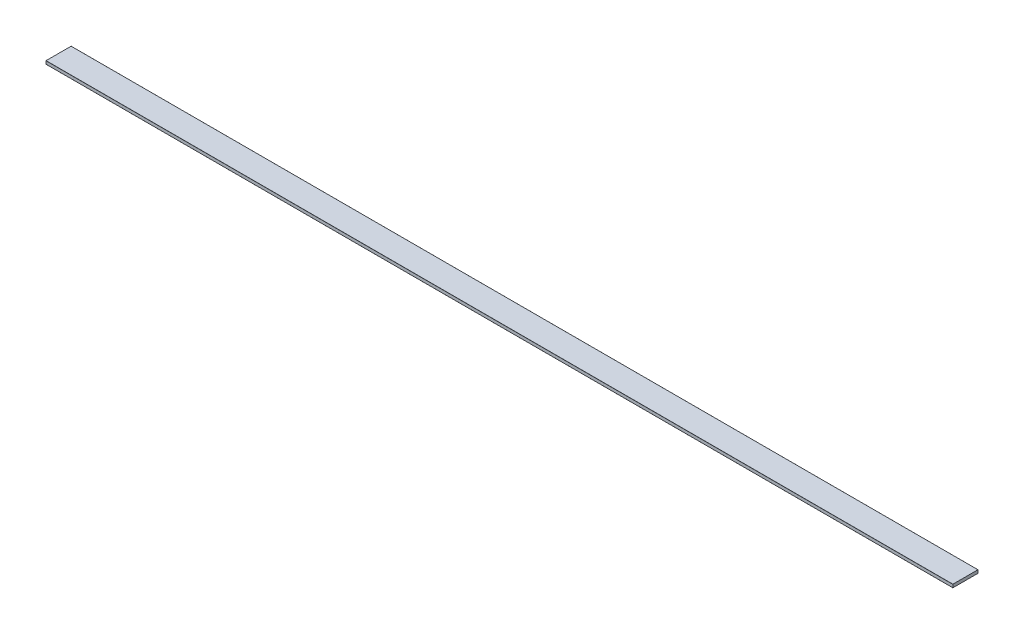
ISO-10303-21;
HEADER;
FILE_DESCRIPTION(('STEP AP214'),'2;1');
FILE_NAME('part.step','',(''),(''),'','','');
FILE_SCHEMA(('AUTOMOTIVE_DESIGN { 1 0 10303 214 1 1 1 1 }'));
ENDSEC;
DATA;
#1=APPLICATION_CONTEXT('core data for automotive mechanical design processes');
#2=APPLICATION_PROTOCOL_DEFINITION('international standard','automotive_design',2000,#1);
#3=PRODUCT_CONTEXT('',#1,'mechanical');
#4=PRODUCT('Part','Part','',(#3));
#5=PRODUCT_RELATED_PRODUCT_CATEGORY('part','',(#4));
#6=PRODUCT_DEFINITION_FORMATION('','',#4);
#7=PRODUCT_DEFINITION_CONTEXT('part definition',#1,'design');
#8=PRODUCT_DEFINITION('design','',#6,#7);
#9=PRODUCT_DEFINITION_SHAPE('','',#8);
#10=(LENGTH_UNIT() NAMED_UNIT(*) SI_UNIT(.MILLI.,.METRE.));
#11=(NAMED_UNIT(*) PLANE_ANGLE_UNIT() SI_UNIT($,.RADIAN.));
#12=(NAMED_UNIT(*) SI_UNIT($,.STERADIAN.) SOLID_ANGLE_UNIT());
#13=UNCERTAINTY_MEASURE_WITH_UNIT(LENGTH_MEASURE(1.E-05),#10,'distance_accuracy_value','');
#14=(GEOMETRIC_REPRESENTATION_CONTEXT(3) GLOBAL_UNCERTAINTY_ASSIGNED_CONTEXT((#13)) GLOBAL_UNIT_ASSIGNED_CONTEXT((#10,
#11,#12)) REPRESENTATION_CONTEXT('',''));
#15=CARTESIAN_POINT('',(0.,0.,0.));
#16=DIRECTION('',(0.,0.,1.));
#17=DIRECTION('',(1.,0.,0.));
#18=AXIS2_PLACEMENT_3D('',#15,#16,#17);
#19=CARTESIAN_POINT('',(-457.2,-1.58750000000001,-12.6999999999999));
#20=DIRECTION('',(-1.,0.,0.));
#21=DIRECTION('',(0.,0.,1.));
#22=AXIS2_PLACEMENT_3D('',#19,#20,#21);
#23=PLANE('',#22);
#24=DIRECTION('',(0.,0.,1.));
#25=VECTOR('',#24,1.);
#26=CARTESIAN_POINT('',(-457.2,-1.58750000000001,-12.6999999999999));
#27=LINE('',#26,#25);
#28=CARTESIAN_POINT('',(-457.2,-1.58750000000001,-12.5952249999999));
#29=VERTEX_POINT('',#28);
#30=CARTESIAN_POINT('',(-457.2,-1.58750000000001,12.5952249999999));
#31=VERTEX_POINT('',#30);
#32=EDGE_CURVE('E162',#29,#31,#27,.T.);
#33=ORIENTED_EDGE('',*,*,#32,.T.);
#34=CARTESIAN_POINT('',(-457.2,-1.48272500000001,12.5952249999999));
#35=DIRECTION('',(-1.,0.,0.));
#36=DIRECTION('',(0.,0.,1.));
#37=AXIS2_PLACEMENT_3D('',#34,#35,#36);
#38=CIRCLE('',#37,0.104775);
#39=CARTESIAN_POINT('',(-457.2,-1.48272500000001,12.6999999999999));
#40=VERTEX_POINT('',#39);
#41=EDGE_CURVE('E145',#31,#40,#38,.T.);
#42=ORIENTED_EDGE('',*,*,#41,.T.);
#43=DIRECTION('',(0.,1.,0.));
#44=VECTOR('',#43,1.);
#45=CARTESIAN_POINT('',(-457.2,-1.58750000000001,12.6999999999999));
#46=LINE('',#45,#44);
#47=CARTESIAN_POINT('',(-457.2,1.48272499999999,12.6999999999999));
#48=VERTEX_POINT('',#47);
#49=EDGE_CURVE('E119',#40,#48,#46,.T.);
#50=ORIENTED_EDGE('',*,*,#49,.T.);
#51=CARTESIAN_POINT('',(-457.2,1.48272499999999,12.5952249999999));
#52=DIRECTION('',(-1.,0.,0.));
#53=DIRECTION('',(0.,0.,1.));
#54=AXIS2_PLACEMENT_3D('',#51,#52,#53);
#55=CIRCLE('',#54,0.104775);
#56=CARTESIAN_POINT('',(-457.2,1.58749999999999,12.5952249999999));
#57=VERTEX_POINT('',#56);
#58=EDGE_CURVE('E141',#48,#57,#55,.T.);
#59=ORIENTED_EDGE('',*,*,#58,.T.);
#60=DIRECTION('',(0.,0.,1.));
#61=VECTOR('',#60,1.);
#62=CARTESIAN_POINT('',(-457.2,1.58749999999999,-12.6999999999999));
#63=LINE('',#62,#61);
#64=CARTESIAN_POINT('',(-457.2,1.58749999999999,-12.5952249999999));
#65=VERTEX_POINT('',#64);
#66=EDGE_CURVE('E158',#65,#57,#63,.T.);
#67=ORIENTED_EDGE('',*,*,#66,.F.);
#68=CARTESIAN_POINT('',(-457.2,1.48272499999999,-12.5952249999999));
#69=DIRECTION('',(-1.,0.,0.));
#70=DIRECTION('',(0.,0.,1.));
#71=AXIS2_PLACEMENT_3D('',#68,#69,#70);
#72=CIRCLE('',#71,0.104775);
#73=CARTESIAN_POINT('',(-457.2,1.48272499999999,-12.6999999999999));
#74=VERTEX_POINT('',#73);
#75=EDGE_CURVE('E47',#65,#74,#72,.T.);
#76=ORIENTED_EDGE('',*,*,#75,.T.);
#77=DIRECTION('',(0.,1.,0.));
#78=VECTOR('',#77,1.);
#79=CARTESIAN_POINT('',(-457.2,-1.58750000000001,-12.6999999999999));
#80=LINE('',#79,#78);
#81=CARTESIAN_POINT('',(-457.2,-1.48272500000001,-12.6999999999999));
#82=VERTEX_POINT('',#81);
#83=EDGE_CURVE('E128',#82,#74,#80,.T.);
#84=ORIENTED_EDGE('',*,*,#83,.F.);
#85=CARTESIAN_POINT('',(-457.2,-1.48272500000001,-12.5952249999999));
#86=DIRECTION('',(-1.,0.,0.));
#87=DIRECTION('',(0.,0.,1.));
#88=AXIS2_PLACEMENT_3D('',#85,#86,#87);
#89=CIRCLE('',#88,0.104775);
#90=EDGE_CURVE('E55',#82,#29,#89,.T.);
#91=ORIENTED_EDGE('',*,*,#90,.T.);
#92=EDGE_LOOP('',(#33,#42,#50,#59,#67,#76,#84,#91));
#93=FACE_BOUND('',#92,.T.);
#94=ADVANCED_FACE('F32',(#93),#23,.T.);
#95=CARTESIAN_POINT('',(-457.2,-1.58750000000001,-12.6999999999999));
#96=DIRECTION('',(0.,0.,-1.));
#97=DIRECTION('',(-1.,0.,0.));
#98=AXIS2_PLACEMENT_3D('',#95,#96,#97);
#99=PLANE('',#98);
#100=DIRECTION('',(0.,1.,0.));
#101=VECTOR('',#100,1.);
#102=CARTESIAN_POINT('',(457.2,-1.58750000000001,-12.6999999999999));
#103=LINE('',#102,#101);
#104=CARTESIAN_POINT('',(457.2,-1.48272500000001,-12.6999999999999));
#105=VERTEX_POINT('',#104);
#106=CARTESIAN_POINT('',(457.2,1.48272499999999,-12.6999999999999));
#107=VERTEX_POINT('',#106);
#108=EDGE_CURVE('E125',#105,#107,#103,.T.);
#109=ORIENTED_EDGE('',*,*,#108,.F.);
#110=DIRECTION('',(-1.,0.,0.));
#111=VECTOR('',#110,1.);
#112=CARTESIAN_POINT('',(-457.2,-1.48272500000001,-12.6999999999999));
#113=LINE('',#112,#111);
#114=EDGE_CURVE('E149',#105,#82,#113,.T.);
#115=ORIENTED_EDGE('',*,*,#114,.T.);
#116=ORIENTED_EDGE('',*,*,#83,.T.);
#117=DIRECTION('',(-1.,0.,0.));
#118=VECTOR('',#117,1.);
#119=CARTESIAN_POINT('',(-457.2,1.48272499999999,-12.6999999999999));
#120=LINE('',#119,#118);
#121=EDGE_CURVE('E147',#74,#107,#120,.F.);
#122=ORIENTED_EDGE('',*,*,#121,.T.);
#123=EDGE_LOOP('',(#109,#115,#116,#122));
#124=FACE_BOUND('',#123,.T.);
#125=ADVANCED_FACE('F171',(#124),#99,.T.);
#126=CARTESIAN_POINT('',(457.2,-1.58750000000001,-12.6999999999999));
#127=DIRECTION('',(1.,0.,0.));
#128=DIRECTION('',(0.,0.,-1.));
#129=AXIS2_PLACEMENT_3D('',#126,#127,#128);
#130=PLANE('',#129);
#131=DIRECTION('',(0.,1.,0.));
#132=VECTOR('',#131,1.);
#133=CARTESIAN_POINT('',(457.2,-1.58750000000001,12.6999999999999));
#134=LINE('',#133,#132);
#135=CARTESIAN_POINT('',(457.2,-1.48272500000001,12.6999999999999));
#136=VERTEX_POINT('',#135);
#137=CARTESIAN_POINT('',(457.2,1.48272499999999,12.6999999999999));
#138=VERTEX_POINT('',#137);
#139=EDGE_CURVE('E116',#136,#138,#134,.T.);
#140=ORIENTED_EDGE('',*,*,#139,.F.);
#141=CARTESIAN_POINT('',(457.2,-1.48272500000001,12.5952249999999));
#142=DIRECTION('',(1.,0.,0.));
#143=DIRECTION('',(0.,0.,-1.));
#144=AXIS2_PLACEMENT_3D('',#141,#142,#143);
#145=CIRCLE('',#144,0.104775);
#146=CARTESIAN_POINT('',(457.2,-1.58750000000001,12.5952249999999));
#147=VERTEX_POINT('',#146);
#148=EDGE_CURVE('E99',#136,#147,#145,.T.);
#149=ORIENTED_EDGE('',*,*,#148,.T.);
#150=DIRECTION('',(0.,0.,-1.));
#151=VECTOR('',#150,1.);
#152=CARTESIAN_POINT('',(457.2,-1.58750000000001,-12.6999999999999));
#153=LINE('',#152,#151);
#154=CARTESIAN_POINT('',(457.2,-1.58750000000001,-12.5952249999999));
#155=VERTEX_POINT('',#154);
#156=EDGE_CURVE('E130',#147,#155,#153,.T.);
#157=ORIENTED_EDGE('',*,*,#156,.T.);
#158=CARTESIAN_POINT('',(457.2,-1.48272500000001,-12.5952249999999));
#159=DIRECTION('',(1.,0.,0.));
#160=DIRECTION('',(0.,0.,-1.));
#161=AXIS2_PLACEMENT_3D('',#158,#159,#160);
#162=CIRCLE('',#161,0.104775);
#163=EDGE_CURVE('E110',#155,#105,#162,.T.);
#164=ORIENTED_EDGE('',*,*,#163,.T.);
#165=ORIENTED_EDGE('',*,*,#108,.T.);
#166=CARTESIAN_POINT('',(457.2,1.48272499999999,-12.5952249999999));
#167=DIRECTION('',(1.,0.,0.));
#168=DIRECTION('',(0.,0.,-1.));
#169=AXIS2_PLACEMENT_3D('',#166,#167,#168);
#170=CIRCLE('',#169,0.104775);
#171=CARTESIAN_POINT('',(457.2,1.58749999999999,-12.5952249999999));
#172=VERTEX_POINT('',#171);
#173=EDGE_CURVE('E136',#107,#172,#170,.T.);
#174=ORIENTED_EDGE('',*,*,#173,.T.);
#175=DIRECTION('',(0.,0.,-1.));
#176=VECTOR('',#175,1.);
#177=CARTESIAN_POINT('',(457.2,1.58749999999999,-12.6999999999999));
#178=LINE('',#177,#176);
#179=CARTESIAN_POINT('',(457.2,1.58749999999999,12.5952249999999));
#180=VERTEX_POINT('',#179);
#181=EDGE_CURVE('E156',#180,#172,#178,.T.);
#182=ORIENTED_EDGE('',*,*,#181,.F.);
#183=CARTESIAN_POINT('',(457.2,1.48272499999999,12.5952249999999));
#184=DIRECTION('',(1.,0.,0.));
#185=DIRECTION('',(0.,0.,-1.));
#186=AXIS2_PLACEMENT_3D('',#183,#184,#185);
#187=CIRCLE('',#186,0.104775);
#188=EDGE_CURVE('E120',#180,#138,#187,.T.);
#189=ORIENTED_EDGE('',*,*,#188,.T.);
#190=EDGE_LOOP('',(#140,#149,#157,#164,#165,#174,#182,#189));
#191=FACE_BOUND('',#190,.T.);
#192=ADVANCED_FACE('F123',(#191),#130,.T.);
#193=CARTESIAN_POINT('',(-457.2,-1.58750000000001,12.6999999999999));
#194=DIRECTION('',(0.,0.,1.));
#195=DIRECTION('',(1.,0.,0.));
#196=AXIS2_PLACEMENT_3D('',#193,#194,#195);
#197=PLANE('',#196);
#198=ORIENTED_EDGE('',*,*,#49,.F.);
#199=DIRECTION('',(1.,0.,0.));
#200=VECTOR('',#199,1.);
#201=CARTESIAN_POINT('',(457.2,-1.48272500000001,12.6999999999999));
#202=LINE('',#201,#200);
#203=EDGE_CURVE('E103',#40,#136,#202,.T.);
#204=ORIENTED_EDGE('',*,*,#203,.T.);
#205=ORIENTED_EDGE('',*,*,#139,.T.);
#206=DIRECTION('',(1.,0.,0.));
#207=VECTOR('',#206,1.);
#208=CARTESIAN_POINT('',(-457.2,1.48272499999999,12.6999999999999));
#209=LINE('',#208,#207);
#210=EDGE_CURVE('E121',#138,#48,#209,.F.);
#211=ORIENTED_EDGE('',*,*,#210,.T.);
#212=EDGE_LOOP('',(#198,#204,#205,#211));
#213=FACE_BOUND('',#212,.T.);
#214=ADVANCED_FACE('F115',(#213),#197,.T.);
#215=CARTESIAN_POINT('',(0.,-1.58750000000001,0.));
#216=DIRECTION('',(0.,1.,0.));
#217=DIRECTION('',(0.,0.,1.));
#218=AXIS2_PLACEMENT_3D('',#215,#216,#217);
#219=PLANE('',#218);
#220=ORIENTED_EDGE('',*,*,#156,.F.);
#221=DIRECTION('',(1.,0.,0.));
#222=VECTOR('',#221,1.);
#223=CARTESIAN_POINT('',(-457.2,-1.58750000000001,12.5952249999999));
#224=LINE('',#223,#222);
#225=EDGE_CURVE('E104',#147,#31,#224,.F.);
#226=ORIENTED_EDGE('',*,*,#225,.T.);
#227=ORIENTED_EDGE('',*,*,#32,.F.);
#228=DIRECTION('',(-1.,0.,0.));
#229=VECTOR('',#228,1.);
#230=CARTESIAN_POINT('',(457.2,-1.58750000000001,-12.5952249999999));
#231=LINE('',#230,#229);
#232=EDGE_CURVE('E109',#29,#155,#231,.F.);
#233=ORIENTED_EDGE('',*,*,#232,.T.);
#234=EDGE_LOOP('',(#220,#226,#227,#233));
#235=FACE_BOUND('',#234,.T.);
#236=ADVANCED_FACE('F195',(#235),#219,.F.);
#237=CARTESIAN_POINT('',(0.,1.58749999999999,0.));
#238=DIRECTION('',(0.,1.,0.));
#239=DIRECTION('',(0.,0.,1.));
#240=AXIS2_PLACEMENT_3D('',#237,#238,#239);
#241=PLANE('',#240);
#242=ORIENTED_EDGE('',*,*,#181,.T.);
#243=DIRECTION('',(-1.,0.,0.));
#244=VECTOR('',#243,1.);
#245=CARTESIAN_POINT('',(0.,1.58749999999999,-12.5952249999999));
#246=LINE('',#245,#244);
#247=EDGE_CURVE('E11',#172,#65,#246,.T.);
#248=ORIENTED_EDGE('',*,*,#247,.T.);
#249=ORIENTED_EDGE('',*,*,#66,.T.);
#250=DIRECTION('',(1.,0.,0.));
#251=VECTOR('',#250,1.);
#252=CARTESIAN_POINT('',(0.,1.58749999999999,12.5952249999999));
#253=LINE('',#252,#251);
#254=EDGE_CURVE('E40',#57,#180,#253,.T.);
#255=ORIENTED_EDGE('',*,*,#254,.T.);
#256=EDGE_LOOP('',(#242,#248,#249,#255));
#257=FACE_BOUND('',#256,.T.);
#258=ADVANCED_FACE('F155',(#257),#241,.T.);
#259=CARTESIAN_POINT('',(-457.2,-1.48272500000001,12.5952249999999));
#260=DIRECTION('',(-1.,0.,0.));
#261=DIRECTION('',(0.,0.,1.));
#262=AXIS2_PLACEMENT_3D('',#259,#260,#261);
#263=CYLINDRICAL_SURFACE('',#262,0.104775);
#264=ORIENTED_EDGE('',*,*,#41,.F.);
#265=ORIENTED_EDGE('',*,*,#225,.F.);
#266=ORIENTED_EDGE('',*,*,#148,.F.);
#267=ORIENTED_EDGE('',*,*,#203,.F.);
#268=EDGE_LOOP('',(#264,#265,#266,#267));
#269=FACE_BOUND('',#268,.T.);
#270=ADVANCED_FACE('F102',(#269),#263,.T.);
#271=CARTESIAN_POINT('',(-457.2,-1.48272500000001,-12.5952249999999));
#272=DIRECTION('',(1.,0.,0.));
#273=DIRECTION('',(0.,0.,-1.));
#274=AXIS2_PLACEMENT_3D('',#271,#272,#273);
#275=CYLINDRICAL_SURFACE('',#274,0.104775);
#276=ORIENTED_EDGE('',*,*,#163,.F.);
#277=ORIENTED_EDGE('',*,*,#232,.F.);
#278=ORIENTED_EDGE('',*,*,#90,.F.);
#279=ORIENTED_EDGE('',*,*,#114,.F.);
#280=EDGE_LOOP('',(#276,#277,#278,#279));
#281=FACE_BOUND('',#280,.T.);
#282=ADVANCED_FACE('F178',(#281),#275,.T.);
#283=CARTESIAN_POINT('',(0.,1.48272499999999,-12.5952249999999));
#284=DIRECTION('',(-1.,0.,0.));
#285=DIRECTION('',(0.,0.,1.));
#286=AXIS2_PLACEMENT_3D('',#283,#284,#285);
#287=CYLINDRICAL_SURFACE('',#286,0.104775);
#288=ORIENTED_EDGE('',*,*,#173,.F.);
#289=ORIENTED_EDGE('',*,*,#121,.F.);
#290=ORIENTED_EDGE('',*,*,#75,.F.);
#291=ORIENTED_EDGE('',*,*,#247,.F.);
#292=EDGE_LOOP('',(#288,#289,#290,#291));
#293=FACE_BOUND('',#292,.T.);
#294=ADVANCED_FACE('F173',(#293),#287,.T.);
#295=CARTESIAN_POINT('',(0.,1.48272499999999,12.5952249999999));
#296=DIRECTION('',(1.,0.,0.));
#297=DIRECTION('',(0.,0.,-1.));
#298=AXIS2_PLACEMENT_3D('',#295,#296,#297);
#299=CYLINDRICAL_SURFACE('',#298,0.104775);
#300=ORIENTED_EDGE('',*,*,#58,.F.);
#301=ORIENTED_EDGE('',*,*,#210,.F.);
#302=ORIENTED_EDGE('',*,*,#188,.F.);
#303=ORIENTED_EDGE('',*,*,#254,.F.);
#304=EDGE_LOOP('',(#300,#301,#302,#303));
#305=FACE_BOUND('',#304,.T.);
#306=ADVANCED_FACE('F34',(#305),#299,.T.);
#307=CLOSED_SHELL('',(#94,#125,#192,#214,#236,#258,#270,#282,#294,#306));
#308=MANIFOLD_SOLID_BREP('B2',#307);
#309=ADVANCED_BREP_SHAPE_REPRESENTATION('',(#18,#308),#14);
#310=SHAPE_DEFINITION_REPRESENTATION(#9,#309);
ENDSEC;
END-ISO-10303-21;
